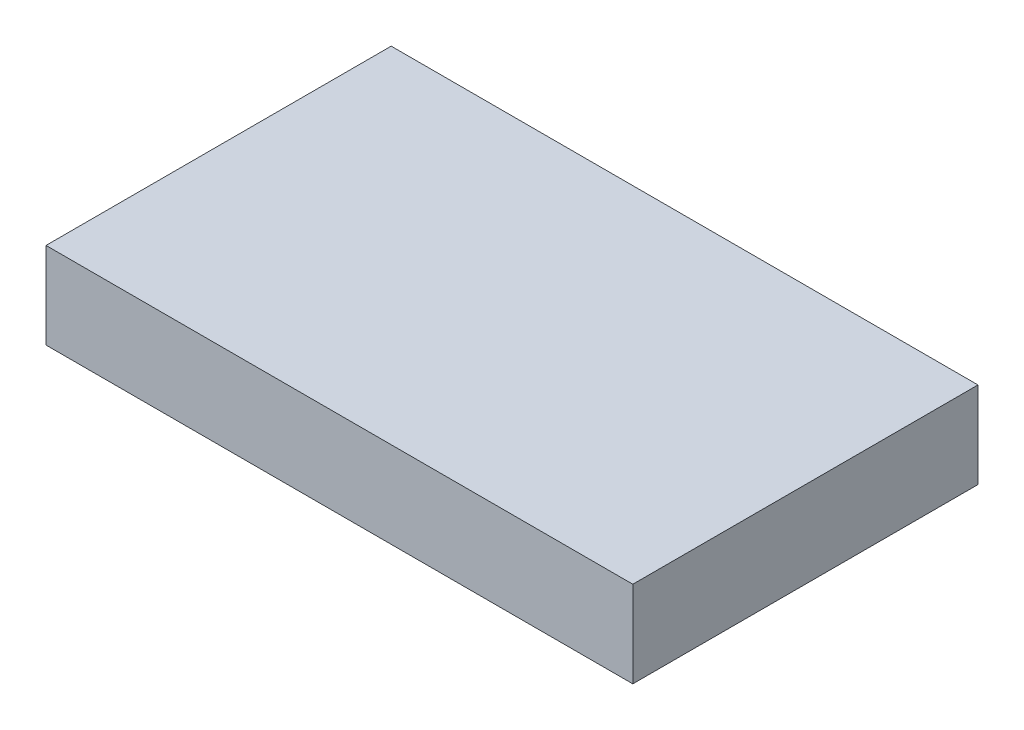
ISO-10303-21;
HEADER;
FILE_DESCRIPTION(('STEP AP214'),'2;1');
FILE_NAME('part.step','',(''),(''),'','','');
FILE_SCHEMA(('AUTOMOTIVE_DESIGN { 1 0 10303 214 1 1 1 1 }'));
ENDSEC;
DATA;
#1=APPLICATION_CONTEXT('core data for automotive mechanical design processes');
#2=APPLICATION_PROTOCOL_DEFINITION('international standard','automotive_design',2000,#1);
#3=PRODUCT_CONTEXT('',#1,'mechanical');
#4=PRODUCT('Part','Part','',(#3));
#5=PRODUCT_RELATED_PRODUCT_CATEGORY('part','',(#4));
#6=PRODUCT_DEFINITION_FORMATION('','',#4);
#7=PRODUCT_DEFINITION_CONTEXT('part definition',#1,'design');
#8=PRODUCT_DEFINITION('design','',#6,#7);
#9=PRODUCT_DEFINITION_SHAPE('','',#8);
#10=(LENGTH_UNIT() NAMED_UNIT(*) SI_UNIT(.MILLI.,.METRE.));
#11=(NAMED_UNIT(*) PLANE_ANGLE_UNIT() SI_UNIT($,.RADIAN.));
#12=(NAMED_UNIT(*) SI_UNIT($,.STERADIAN.) SOLID_ANGLE_UNIT());
#13=UNCERTAINTY_MEASURE_WITH_UNIT(LENGTH_MEASURE(1.E-05),#10,'distance_accuracy_value','');
#14=(GEOMETRIC_REPRESENTATION_CONTEXT(3) GLOBAL_UNCERTAINTY_ASSIGNED_CONTEXT((#13)) GLOBAL_UNIT_ASSIGNED_CONTEXT((#10,
#11,#12)) REPRESENTATION_CONTEXT('',''));
#15=CARTESIAN_POINT('',(0.,0.,0.));
#16=DIRECTION('',(0.,0.,1.));
#17=DIRECTION('',(1.,0.,0.));
#18=AXIS2_PLACEMENT_3D('',#15,#16,#17);
#19=CARTESIAN_POINT('',(-8.13117634356896,-0.0307455392940281,2.03982353210449));
#20=DIRECTION('',(0.,0.,1.));
#21=DIRECTION('',(1.,0.,0.));
#22=AXIS2_PLACEMENT_3D('',#19,#20,#21);
#23=PLANE('',#22);
#24=DIRECTION('',(0.,1.,0.));
#25=VECTOR('',#24,1.);
#26=CARTESIAN_POINT('',(-6.43117558062951,-3.08074859105184,2.03982353210449));
#27=LINE('',#26,#25);
#28=CARTESIAN_POINT('',(-6.43117558062951,-3.58074859105184,2.03982353210449));
#29=VERTEX_POINT('',#28);
#30=CARTESIAN_POINT('',(-6.43117558062951,-3.08074859105184,2.03982353210449));
#31=VERTEX_POINT('',#30);
#32=EDGE_CURVE('E11',#29,#31,#27,.T.);
#33=ORIENTED_EDGE('',*,*,#32,.T.);
#34=DIRECTION('',(-1.,0.,0.));
#35=VECTOR('',#34,1.);
#36=CARTESIAN_POINT('',(-9.83117710650841,-3.08074859105184,2.03982353210449));
#37=LINE('',#36,#35);
#38=CARTESIAN_POINT('',(-9.83117710650841,-3.08074859105184,2.03982353210449));
#39=VERTEX_POINT('',#38);
#40=EDGE_CURVE('E68',#31,#39,#37,.T.);
#41=ORIENTED_EDGE('',*,*,#40,.T.);
#42=DIRECTION('',(0.,-1.,0.));
#43=VECTOR('',#42,1.);
#44=CARTESIAN_POINT('',(-9.83117710650841,-3.58074859105184,2.03982353210449));
#45=LINE('',#44,#43);
#46=CARTESIAN_POINT('',(-9.83117710650841,-3.58074859105184,2.03982353210449));
#47=VERTEX_POINT('',#46);
#48=EDGE_CURVE('E62',#39,#47,#45,.T.);
#49=ORIENTED_EDGE('',*,*,#48,.T.);
#50=DIRECTION('',(1.,0.,0.));
#51=VECTOR('',#50,1.);
#52=CARTESIAN_POINT('',(-6.43117558062951,-3.58074859105184,2.03982353210449));
#53=LINE('',#52,#51);
#54=EDGE_CURVE('E65',#47,#29,#53,.T.);
#55=ORIENTED_EDGE('',*,*,#54,.T.);
#56=EDGE_LOOP('',(#33,#41,#49,#55));
#57=FACE_BOUND('',#56,.T.);
#58=ADVANCED_FACE('F17',(#57),#23,.T.);
#59=CARTESIAN_POINT('',(-8.13117634356896,-0.0307455392940281,0.039823025916117));
#60=DIRECTION('',(0.,0.,-1.));
#61=DIRECTION('',(0.,-1.,0.));
#62=AXIS2_PLACEMENT_3D('',#59,#60,#61);
#63=PLANE('',#62);
#64=DIRECTION('',(0.,-1.,0.));
#65=VECTOR('',#64,1.);
#66=CARTESIAN_POINT('',(-6.43117558062951,-3.08074859105184,0.039823025916117));
#67=LINE('',#66,#65);
#68=CARTESIAN_POINT('',(-6.43117558062951,-3.08074859105184,0.039823025916117));
#69=VERTEX_POINT('',#68);
#70=CARTESIAN_POINT('',(-6.43117558062951,-3.58074859105184,0.039823025916117));
#71=VERTEX_POINT('',#70);
#72=EDGE_CURVE('E27',#69,#71,#67,.T.);
#73=ORIENTED_EDGE('',*,*,#72,.T.);
#74=DIRECTION('',(-1.,0.,0.));
#75=VECTOR('',#74,1.);
#76=CARTESIAN_POINT('',(-6.43117558062951,-3.58074859105184,0.039823025916117));
#77=LINE('',#76,#75);
#78=CARTESIAN_POINT('',(-9.83117710650841,-3.58074859105184,0.039823025916117));
#79=VERTEX_POINT('',#78);
#80=EDGE_CURVE('E94',#71,#79,#77,.T.);
#81=ORIENTED_EDGE('',*,*,#80,.T.);
#82=DIRECTION('',(0.,1.,0.));
#83=VECTOR('',#82,1.);
#84=CARTESIAN_POINT('',(-9.83117710650841,-3.58074859105184,0.039823025916117));
#85=LINE('',#84,#83);
#86=CARTESIAN_POINT('',(-9.83117710650841,-3.08074859105184,0.039823025916117));
#87=VERTEX_POINT('',#86);
#88=EDGE_CURVE('E74',#79,#87,#85,.T.);
#89=ORIENTED_EDGE('',*,*,#88,.T.);
#90=DIRECTION('',(1.,0.,0.));
#91=VECTOR('',#90,1.);
#92=CARTESIAN_POINT('',(-9.83117710650841,-3.08074859105184,0.039823025916117));
#93=LINE('',#92,#91);
#94=EDGE_CURVE('E138',#87,#69,#93,.T.);
#95=ORIENTED_EDGE('',*,*,#94,.T.);
#96=EDGE_LOOP('',(#73,#81,#89,#95));
#97=FACE_BOUND('',#96,.T.);
#98=ADVANCED_FACE('F104',(#97),#63,.T.);
#99=CARTESIAN_POINT('',(-6.43117558062951,-3.58074859105184,0.039823025916117));
#100=DIRECTION('',(1.,0.,0.));
#101=DIRECTION('',(0.,1.,0.));
#102=AXIS2_PLACEMENT_3D('',#99,#100,#101);
#103=PLANE('',#102);
#104=ORIENTED_EDGE('',*,*,#72,.F.);
#105=DIRECTION('',(0.,0.,1.));
#106=VECTOR('',#105,1.);
#107=CARTESIAN_POINT('',(-6.43117558062951,-3.08074859105184,0.039823025916117));
#108=LINE('',#107,#106);
#109=EDGE_CURVE('E99',#69,#31,#108,.T.);
#110=ORIENTED_EDGE('',*,*,#109,.T.);
#111=ORIENTED_EDGE('',*,*,#32,.F.);
#112=DIRECTION('',(0.,0.,1.));
#113=VECTOR('',#112,1.);
#114=CARTESIAN_POINT('',(-6.43117558062951,-3.58074859105184,0.039823025916117));
#115=LINE('',#114,#113);
#116=EDGE_CURVE('E87',#71,#29,#115,.T.);
#117=ORIENTED_EDGE('',*,*,#116,.F.);
#118=EDGE_LOOP('',(#104,#110,#111,#117));
#119=FACE_BOUND('',#118,.T.);
#120=ADVANCED_FACE('F143',(#119),#103,.T.);
#121=CARTESIAN_POINT('',(-6.43117558062951,-3.08074859105184,0.039823025916117));
#122=DIRECTION('',(0.,1.,0.));
#123=DIRECTION('',(1.,0.,0.));
#124=AXIS2_PLACEMENT_3D('',#121,#122,#123);
#125=PLANE('',#124);
#126=ORIENTED_EDGE('',*,*,#94,.F.);
#127=DIRECTION('',(0.,0.,1.));
#128=VECTOR('',#127,1.);
#129=CARTESIAN_POINT('',(-9.83117710650841,-3.08074859105184,0.039823025916117));
#130=LINE('',#129,#128);
#131=EDGE_CURVE('E73',#87,#39,#130,.T.);
#132=ORIENTED_EDGE('',*,*,#131,.T.);
#133=ORIENTED_EDGE('',*,*,#40,.F.);
#134=ORIENTED_EDGE('',*,*,#109,.F.);
#135=EDGE_LOOP('',(#126,#132,#133,#134));
#136=FACE_BOUND('',#135,.T.);
#137=ADVANCED_FACE('F19',(#136),#125,.T.);
#138=CARTESIAN_POINT('',(-9.83117710650841,-3.08074859105184,0.039823025916117));
#139=DIRECTION('',(-1.,0.,0.));
#140=DIRECTION('',(0.,0.,1.));
#141=AXIS2_PLACEMENT_3D('',#138,#139,#140);
#142=PLANE('',#141);
#143=ORIENTED_EDGE('',*,*,#88,.F.);
#144=DIRECTION('',(0.,0.,1.));
#145=VECTOR('',#144,1.);
#146=CARTESIAN_POINT('',(-9.83117710650841,-3.58074859105184,0.039823025916117));
#147=LINE('',#146,#145);
#148=EDGE_CURVE('E77',#79,#47,#147,.T.);
#149=ORIENTED_EDGE('',*,*,#148,.T.);
#150=ORIENTED_EDGE('',*,*,#48,.F.);
#151=ORIENTED_EDGE('',*,*,#131,.F.);
#152=EDGE_LOOP('',(#143,#149,#150,#151));
#153=FACE_BOUND('',#152,.T.);
#154=ADVANCED_FACE('F78',(#153),#142,.T.);
#155=CARTESIAN_POINT('',(-9.83117710650841,-3.58074859105184,0.039823025916117));
#156=DIRECTION('',(0.,-1.,0.));
#157=DIRECTION('',(0.,0.,-1.));
#158=AXIS2_PLACEMENT_3D('',#155,#156,#157);
#159=PLANE('',#158);
#160=ORIENTED_EDGE('',*,*,#80,.F.);
#161=ORIENTED_EDGE('',*,*,#116,.T.);
#162=ORIENTED_EDGE('',*,*,#54,.F.);
#163=ORIENTED_EDGE('',*,*,#148,.F.);
#164=EDGE_LOOP('',(#160,#161,#162,#163));
#165=FACE_BOUND('',#164,.T.);
#166=ADVANCED_FACE('F85',(#165),#159,.T.);
#167=CLOSED_SHELL('',(#58,#98,#120,#137,#154,#166));
#168=MANIFOLD_SOLID_BREP('B1',#167);
#169=ADVANCED_BREP_SHAPE_REPRESENTATION('',(#18,#168),#14);
#170=SHAPE_DEFINITION_REPRESENTATION(#9,#169);
ENDSEC;
END-ISO-10303-21;
